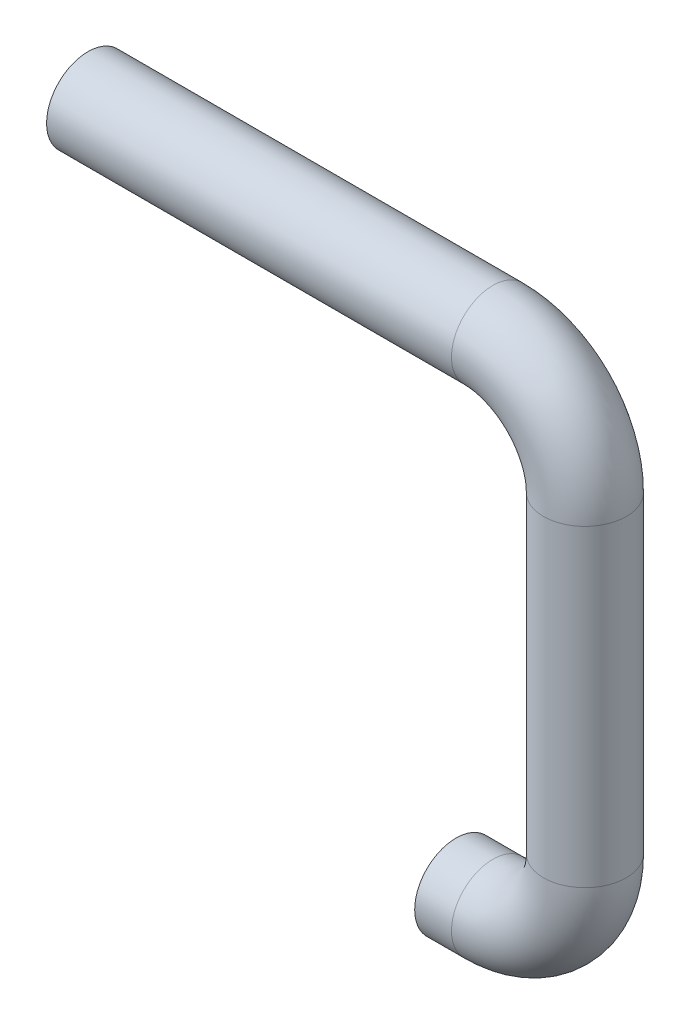
ISO-10303-21;
HEADER;
FILE_DESCRIPTION(('STEP AP214'),'2;1');
FILE_NAME('part.step','',(''),(''),'','','');
FILE_SCHEMA(('AUTOMOTIVE_DESIGN { 1 0 10303 214 1 1 1 1 }'));
ENDSEC;
DATA;
#1=APPLICATION_CONTEXT('core data for automotive mechanical design processes');
#2=APPLICATION_PROTOCOL_DEFINITION('international standard','automotive_design',2000,#1);
#3=PRODUCT_CONTEXT('',#1,'mechanical');
#4=PRODUCT('Part','Part','',(#3));
#5=PRODUCT_RELATED_PRODUCT_CATEGORY('part','',(#4));
#6=PRODUCT_DEFINITION_FORMATION('','',#4);
#7=PRODUCT_DEFINITION_CONTEXT('part definition',#1,'design');
#8=PRODUCT_DEFINITION('design','',#6,#7);
#9=PRODUCT_DEFINITION_SHAPE('','',#8);
#10=(LENGTH_UNIT() NAMED_UNIT(*) SI_UNIT(.MILLI.,.METRE.));
#11=(NAMED_UNIT(*) PLANE_ANGLE_UNIT() SI_UNIT($,.RADIAN.));
#12=(NAMED_UNIT(*) SI_UNIT($,.STERADIAN.) SOLID_ANGLE_UNIT());
#13=UNCERTAINTY_MEASURE_WITH_UNIT(LENGTH_MEASURE(1.E-05),#10,'distance_accuracy_value','');
#14=(GEOMETRIC_REPRESENTATION_CONTEXT(3) GLOBAL_UNCERTAINTY_ASSIGNED_CONTEXT((#13)) GLOBAL_UNIT_ASSIGNED_CONTEXT((#10,
#11,#12)) REPRESENTATION_CONTEXT('',''));
#15=CARTESIAN_POINT('',(0.,0.,0.));
#16=DIRECTION('',(0.,0.,1.));
#17=DIRECTION('',(1.,0.,0.));
#18=AXIS2_PLACEMENT_3D('',#15,#16,#17);
#19=CARTESIAN_POINT('',(210.,-270.,0.));
#20=DIRECTION('',(1.,0.,0.));
#21=DIRECTION('',(0.,0.,-1.));
#22=AXIS2_PLACEMENT_3D('',#19,#20,#21);
#23=PLANE('',#22);
#24=CARTESIAN_POINT('',(210.,-270.,0.));
#25=DIRECTION('',(1.,0.,0.));
#26=DIRECTION('',(0.,0.,-1.));
#27=AXIS2_PLACEMENT_3D('',#24,#25,#26);
#28=CIRCLE('',#27,15.);
#29=CARTESIAN_POINT('',(210.,-270.,-15.));
#30=VERTEX_POINT('',#29);
#31=EDGE_CURVE('E67',#30,#30,#28,.T.);
#32=ORIENTED_EDGE('',*,*,#31,.T.);
#33=EDGE_LOOP('',(#32));
#34=FACE_BOUND('',#33,.T.);
#35=CARTESIAN_POINT('',(210.,-270.,0.));
#36=DIRECTION('',(1.,0.,0.));
#37=DIRECTION('',(0.,0.,-1.));
#38=AXIS2_PLACEMENT_3D('',#35,#36,#37);
#39=CIRCLE('',#38,21.);
#40=CARTESIAN_POINT('',(210.,-270.,-21.));
#41=VERTEX_POINT('',#40);
#42=EDGE_CURVE('E11',#41,#41,#39,.T.);
#43=ORIENTED_EDGE('',*,*,#42,.F.);
#44=EDGE_LOOP('',(#43));
#45=FACE_BOUND('',#44,.T.);
#46=ADVANCED_FACE('F45',(#34,#45),#23,.F.);
#47=CARTESIAN_POINT('',(0.,0.,0.));
#48=DIRECTION('',(-1.,0.,0.));
#49=DIRECTION('',(0.,0.,-1.));
#50=AXIS2_PLACEMENT_3D('',#47,#48,#49);
#51=PLANE('',#50);
#52=CARTESIAN_POINT('',(0.,0.,0.));
#53=DIRECTION('',(-1.,0.,0.));
#54=DIRECTION('',(0.,0.,-1.));
#55=AXIS2_PLACEMENT_3D('',#52,#53,#54);
#56=CIRCLE('',#55,15.);
#57=CARTESIAN_POINT('',(0.,0.,-15.));
#58=VERTEX_POINT('',#57);
#59=EDGE_CURVE('E124',#58,#58,#56,.T.);
#60=ORIENTED_EDGE('',*,*,#59,.F.);
#61=EDGE_LOOP('',(#60));
#62=FACE_BOUND('',#61,.T.);
#63=CARTESIAN_POINT('',(0.,0.,0.));
#64=DIRECTION('',(-1.,0.,0.));
#65=DIRECTION('',(0.,0.,1.));
#66=AXIS2_PLACEMENT_3D('',#63,#64,#65);
#67=CIRCLE('',#66,22.5);
#68=CARTESIAN_POINT('',(0.,0.,22.5));
#69=VERTEX_POINT('',#68);
#70=EDGE_CURVE('E64',#69,#69,#67,.T.);
#71=ORIENTED_EDGE('',*,*,#70,.T.);
#72=EDGE_LOOP('',(#71));
#73=FACE_BOUND('',#72,.T.);
#74=ADVANCED_FACE('F99',(#62,#73),#51,.T.);
#75=CARTESIAN_POINT('',(0.,0.,0.));
#76=DIRECTION('',(1.,0.,0.));
#77=DIRECTION('',(0.,0.,-1.));
#78=AXIS2_PLACEMENT_3D('',#75,#76,#77);
#79=CYLINDRICAL_SURFACE('',#78,22.5);
#80=CARTESIAN_POINT('',(220.,0.,0.));
#81=DIRECTION('',(1.,0.,0.));
#82=DIRECTION('',(0.,0.,-1.));
#83=AXIS2_PLACEMENT_3D('',#80,#81,#82);
#84=CIRCLE('',#83,22.5);
#85=CARTESIAN_POINT('',(220.,22.5,0.));
#86=VERTEX_POINT('',#85);
#87=EDGE_CURVE('E66',#86,#86,#84,.F.);
#88=ORIENTED_EDGE('',*,*,#87,.T.);
#89=EDGE_LOOP('',(#88));
#90=FACE_BOUND('',#89,.T.);
#91=ORIENTED_EDGE('',*,*,#70,.F.);
#92=EDGE_LOOP('',(#91));
#93=FACE_BOUND('',#92,.T.);
#94=ADVANCED_FACE('F96',(#90,#93),#79,.T.);
#95=CARTESIAN_POINT('',(220.,-50.,0.));
#96=DIRECTION('',(0.,0.,-1.));
#97=DIRECTION('',(-1.,0.,0.));
#98=AXIS2_PLACEMENT_3D('',#95,#96,#97);
#99=TOROIDAL_SURFACE('',#98,50.,22.5);
#100=CARTESIAN_POINT('',(270.,-50.,0.));
#101=DIRECTION('',(0.,1.,0.));
#102=DIRECTION('',(-1.,0.,0.));
#103=AXIS2_PLACEMENT_3D('',#100,#101,#102);
#104=CIRCLE('',#103,22.5);
#105=CARTESIAN_POINT('',(292.5,-50.,0.));
#106=VERTEX_POINT('',#105);
#107=EDGE_CURVE('E61',#106,#106,#104,.T.);
#108=CARTESIAN_POINT('',(220.,-50.,0.));
#109=DIRECTION('',(0.,0.,-1.));
#110=DIRECTION('',(-1.,0.,0.));
#111=AXIS2_PLACEMENT_3D('',#108,#109,#110);
#112=CIRCLE('',#111,72.5);
#113=EDGE_CURVE('',#86,#106,#112,.T.);
#114=ORIENTED_EDGE('',*,*,#87,.F.);
#115=ORIENTED_EDGE('',*,*,#107,.T.);
#116=ORIENTED_EDGE('',*,*,#113,.T.);
#117=ORIENTED_EDGE('',*,*,#113,.F.);
#118=EDGE_LOOP('',(#114,#116,#115,#117));
#119=FACE_BOUND('',#118,.T.);
#120=ADVANCED_FACE('F84',(#119),#99,.T.);
#121=CARTESIAN_POINT('',(270.,-50.,0.));
#122=DIRECTION('',(0.,-1.,0.));
#123=DIRECTION('',(1.,0.,0.));
#124=AXIS2_PLACEMENT_3D('',#121,#122,#123);
#125=CYLINDRICAL_SURFACE('',#124,22.5);
#126=CARTESIAN_POINT('',(270.,-220.,0.));
#127=DIRECTION('',(0.,-1.,0.));
#128=DIRECTION('',(1.,0.,0.));
#129=AXIS2_PLACEMENT_3D('',#126,#127,#128);
#130=CIRCLE('',#129,22.5);
#131=CARTESIAN_POINT('',(292.5,-220.,0.));
#132=VERTEX_POINT('',#131);
#133=EDGE_CURVE('E56',#132,#132,#130,.F.);
#134=ORIENTED_EDGE('',*,*,#133,.T.);
#135=EDGE_LOOP('',(#134));
#136=FACE_BOUND('',#135,.T.);
#137=ORIENTED_EDGE('',*,*,#107,.F.);
#138=EDGE_LOOP('',(#137));
#139=FACE_BOUND('',#138,.T.);
#140=ADVANCED_FACE('F87',(#136,#139),#125,.T.);
#141=CARTESIAN_POINT('',(220.,-220.,0.));
#142=DIRECTION('',(0.,0.,-1.));
#143=DIRECTION('',(-1.,0.,0.));
#144=AXIS2_PLACEMENT_3D('',#141,#142,#143);
#145=TOROIDAL_SURFACE('',#144,50.,22.5);
#146=CARTESIAN_POINT('',(220.,-270.,0.));
#147=DIRECTION('',(1.,0.,0.));
#148=DIRECTION('',(0.,1.,0.));
#149=AXIS2_PLACEMENT_3D('',#146,#147,#148);
#150=CIRCLE('',#149,22.5);
#151=CARTESIAN_POINT('',(220.,-292.5,0.));
#152=VERTEX_POINT('',#151);
#153=EDGE_CURVE('E52',#152,#152,#150,.T.);
#154=CARTESIAN_POINT('',(220.,-220.,0.));
#155=DIRECTION('',(0.,0.,-1.));
#156=DIRECTION('',(-1.,0.,0.));
#157=AXIS2_PLACEMENT_3D('',#154,#155,#156);
#158=CIRCLE('',#157,72.5);
#159=EDGE_CURVE('',#132,#152,#158,.T.);
#160=ORIENTED_EDGE('',*,*,#133,.F.);
#161=ORIENTED_EDGE('',*,*,#153,.T.);
#162=ORIENTED_EDGE('',*,*,#159,.T.);
#163=ORIENTED_EDGE('',*,*,#159,.F.);
#164=EDGE_LOOP('',(#160,#162,#161,#163));
#165=FACE_BOUND('',#164,.T.);
#166=ADVANCED_FACE('F89',(#165),#145,.T.);
#167=CARTESIAN_POINT('',(220.,-270.,0.));
#168=DIRECTION('',(-1.,0.,0.));
#169=DIRECTION('',(0.,0.,1.));
#170=AXIS2_PLACEMENT_3D('',#167,#168,#169);
#171=CYLINDRICAL_SURFACE('',#170,22.5);
#172=ORIENTED_EDGE('',*,*,#153,.F.);
#173=EDGE_LOOP('',(#172));
#174=FACE_BOUND('',#173,.T.);
#175=CARTESIAN_POINT('',(200.,-270.,0.));
#176=DIRECTION('',(-1.,0.,0.));
#177=DIRECTION('',(0.,0.,1.));
#178=AXIS2_PLACEMENT_3D('',#175,#176,#177);
#179=CIRCLE('',#178,22.5000000000007);
#180=CARTESIAN_POINT('',(200.,-270.,22.5000000000007));
#181=VERTEX_POINT('',#180);
#182=EDGE_CURVE('E122',#181,#181,#179,.T.);
#183=ORIENTED_EDGE('',*,*,#182,.F.);
#184=EDGE_LOOP('',(#183));
#185=FACE_BOUND('',#184,.T.);
#186=ADVANCED_FACE('F47',(#174,#185),#171,.T.);
#187=CARTESIAN_POINT('',(0.,0.,0.));
#188=DIRECTION('',(1.,0.,0.));
#189=DIRECTION('',(0.,0.,-1.));
#190=AXIS2_PLACEMENT_3D('',#187,#188,#189);
#191=CYLINDRICAL_SURFACE('',#190,15.);
#192=CARTESIAN_POINT('',(220.,0.,0.));
#193=DIRECTION('',(-1.,0.,0.));
#194=DIRECTION('',(0.,0.,-1.));
#195=AXIS2_PLACEMENT_3D('',#192,#193,#194);
#196=CIRCLE('',#195,15.);
#197=CARTESIAN_POINT('',(220.,15.,0.));
#198=VERTEX_POINT('',#197);
#199=EDGE_CURVE('E128',#198,#198,#196,.T.);
#200=ORIENTED_EDGE('',*,*,#199,.F.);
#201=EDGE_LOOP('',(#200));
#202=FACE_BOUND('',#201,.T.);
#203=ORIENTED_EDGE('',*,*,#59,.T.);
#204=EDGE_LOOP('',(#203));
#205=FACE_BOUND('',#204,.T.);
#206=ADVANCED_FACE('F110',(#202,#205),#191,.F.);
#207=CARTESIAN_POINT('',(220.,-50.,0.));
#208=DIRECTION('',(0.,0.,-1.));
#209=DIRECTION('',(-1.,0.,0.));
#210=AXIS2_PLACEMENT_3D('',#207,#208,#209);
#211=TOROIDAL_SURFACE('',#210,50.,15.);
#212=CARTESIAN_POINT('',(270.,-50.,0.));
#213=DIRECTION('',(0.,1.,0.));
#214=DIRECTION('',(0.,0.,-1.));
#215=AXIS2_PLACEMENT_3D('',#212,#213,#214);
#216=CIRCLE('',#215,15.);
#217=CARTESIAN_POINT('',(285.,-50.,0.));
#218=VERTEX_POINT('',#217);
#219=EDGE_CURVE('E135',#218,#218,#216,.T.);
#220=CARTESIAN_POINT('',(220.,-50.,0.));
#221=DIRECTION('',(0.,0.,-1.));
#222=DIRECTION('',(-1.,0.,0.));
#223=AXIS2_PLACEMENT_3D('',#220,#221,#222);
#224=CIRCLE('',#223,65.);
#225=EDGE_CURVE('',#198,#218,#224,.T.);
#226=ORIENTED_EDGE('',*,*,#199,.T.);
#227=ORIENTED_EDGE('',*,*,#219,.F.);
#228=ORIENTED_EDGE('',*,*,#225,.T.);
#229=ORIENTED_EDGE('',*,*,#225,.F.);
#230=EDGE_LOOP('',(#226,#228,#227,#229));
#231=FACE_BOUND('',#230,.T.);
#232=ADVANCED_FACE('F115',(#231),#211,.F.);
#233=CARTESIAN_POINT('',(270.,-50.,0.));
#234=DIRECTION('',(0.,-1.,0.));
#235=DIRECTION('',(1.,0.,0.));
#236=AXIS2_PLACEMENT_3D('',#233,#234,#235);
#237=CYLINDRICAL_SURFACE('',#236,15.);
#238=CARTESIAN_POINT('',(270.,-220.,0.));
#239=DIRECTION('',(0.,1.,0.));
#240=DIRECTION('',(0.,0.,-1.));
#241=AXIS2_PLACEMENT_3D('',#238,#239,#240);
#242=CIRCLE('',#241,15.);
#243=CARTESIAN_POINT('',(285.,-220.,0.));
#244=VERTEX_POINT('',#243);
#245=EDGE_CURVE('E78',#244,#244,#242,.T.);
#246=ORIENTED_EDGE('',*,*,#245,.F.);
#247=EDGE_LOOP('',(#246));
#248=FACE_BOUND('',#247,.T.);
#249=ORIENTED_EDGE('',*,*,#219,.T.);
#250=EDGE_LOOP('',(#249));
#251=FACE_BOUND('',#250,.T.);
#252=ADVANCED_FACE('F142',(#248,#251),#237,.F.);
#253=CARTESIAN_POINT('',(220.,-220.,0.));
#254=DIRECTION('',(0.,0.,-1.));
#255=DIRECTION('',(-1.,0.,0.));
#256=AXIS2_PLACEMENT_3D('',#253,#254,#255);
#257=TOROIDAL_SURFACE('',#256,50.,15.);
#258=CARTESIAN_POINT('',(220.,-270.,0.));
#259=DIRECTION('',(1.,0.,0.));
#260=DIRECTION('',(0.,0.,-1.));
#261=AXIS2_PLACEMENT_3D('',#258,#259,#260);
#262=CIRCLE('',#261,15.);
#263=CARTESIAN_POINT('',(220.,-285.,0.));
#264=VERTEX_POINT('',#263);
#265=EDGE_CURVE('E73',#264,#264,#262,.T.);
#266=CARTESIAN_POINT('',(220.,-220.,0.));
#267=DIRECTION('',(0.,0.,-1.));
#268=DIRECTION('',(-1.,0.,0.));
#269=AXIS2_PLACEMENT_3D('',#266,#267,#268);
#270=CIRCLE('',#269,65.);
#271=EDGE_CURVE('',#244,#264,#270,.T.);
#272=ORIENTED_EDGE('',*,*,#245,.T.);
#273=ORIENTED_EDGE('',*,*,#265,.F.);
#274=ORIENTED_EDGE('',*,*,#271,.T.);
#275=ORIENTED_EDGE('',*,*,#271,.F.);
#276=EDGE_LOOP('',(#272,#274,#273,#275));
#277=FACE_BOUND('',#276,.T.);
#278=ADVANCED_FACE('F140',(#277),#257,.F.);
#279=CARTESIAN_POINT('',(220.,-270.,0.));
#280=DIRECTION('',(-1.,0.,0.));
#281=DIRECTION('',(0.,0.,1.));
#282=AXIS2_PLACEMENT_3D('',#279,#280,#281);
#283=CYLINDRICAL_SURFACE('',#282,15.);
#284=ORIENTED_EDGE('',*,*,#31,.F.);
#285=EDGE_LOOP('',(#284));
#286=FACE_BOUND('',#285,.T.);
#287=ORIENTED_EDGE('',*,*,#265,.T.);
#288=EDGE_LOOP('',(#287));
#289=FACE_BOUND('',#288,.T.);
#290=ADVANCED_FACE('F106',(#286,#289),#283,.F.);
#291=CARTESIAN_POINT('',(220.,-270.,0.));
#292=DIRECTION('',(-1.,0.,0.));
#293=DIRECTION('',(0.,0.,1.));
#294=AXIS2_PLACEMENT_3D('',#291,#292,#293);
#295=CYLINDRICAL_SURFACE('',#294,21.);
#296=CARTESIAN_POINT('',(200.,-270.,0.));
#297=DIRECTION('',(-1.,0.,0.));
#298=DIRECTION('',(0.,0.,1.));
#299=AXIS2_PLACEMENT_3D('',#296,#297,#298);
#300=CIRCLE('',#299,21.);
#301=CARTESIAN_POINT('',(200.,-270.,21.));
#302=VERTEX_POINT('',#301);
#303=EDGE_CURVE('E125',#302,#302,#300,.T.);
#304=ORIENTED_EDGE('',*,*,#303,.T.);
#305=EDGE_LOOP('',(#304));
#306=FACE_BOUND('',#305,.T.);
#307=ORIENTED_EDGE('',*,*,#42,.T.);
#308=EDGE_LOOP('',(#307));
#309=FACE_BOUND('',#308,.T.);
#310=ADVANCED_FACE('F118',(#306,#309),#295,.F.);
#311=CARTESIAN_POINT('',(200.,-270.,0.));
#312=DIRECTION('',(-1.,0.,0.));
#313=DIRECTION('',(0.,0.,1.));
#314=AXIS2_PLACEMENT_3D('',#311,#312,#313);
#315=PLANE('',#314);
#316=ORIENTED_EDGE('',*,*,#182,.T.);
#317=EDGE_LOOP('',(#316));
#318=FACE_BOUND('',#317,.T.);
#319=ORIENTED_EDGE('',*,*,#303,.F.);
#320=EDGE_LOOP('',(#319));
#321=FACE_BOUND('',#320,.T.);
#322=ADVANCED_FACE('F165',(#318,#321),#315,.T.);
#323=CLOSED_SHELL('',(#46,#74,#94,#120,#140,#166,#186,#206,#232,#252,#278,#290,#310,#322));
#324=MANIFOLD_SOLID_BREP('B2',#323);
#325=ADVANCED_BREP_SHAPE_REPRESENTATION('',(#18,#324),#14);
#326=SHAPE_DEFINITION_REPRESENTATION(#9,#325);
ENDSEC;
END-ISO-10303-21;
